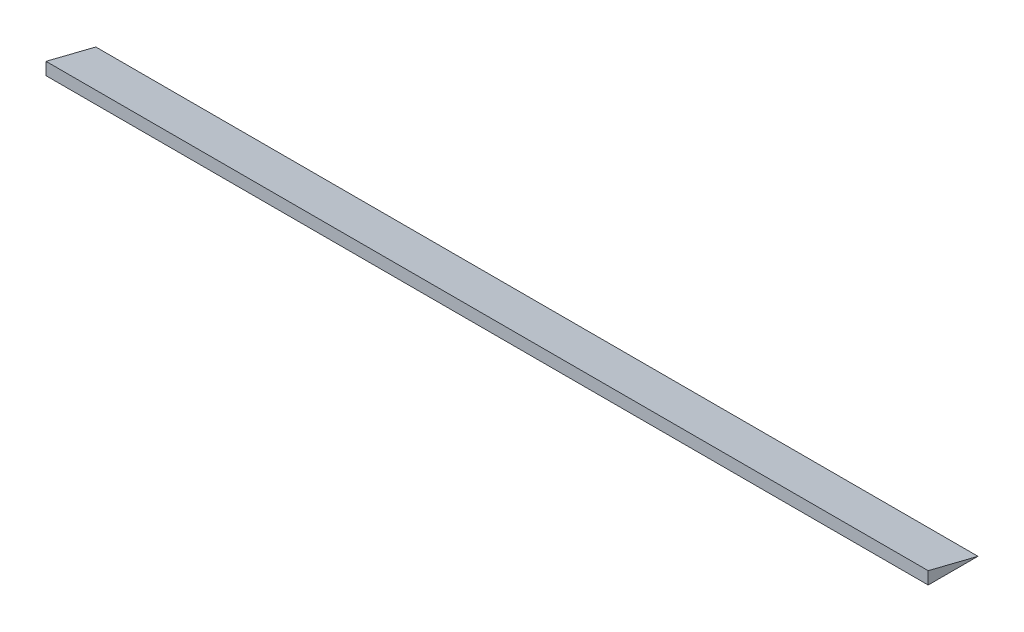
ISO-10303-21;
HEADER;
FILE_DESCRIPTION(('STEP AP214'),'2;1');
FILE_NAME('part.step','',(''),(''),'','','');
FILE_SCHEMA(('AUTOMOTIVE_DESIGN { 1 0 10303 214 1 1 1 1 }'));
ENDSEC;
DATA;
#1=APPLICATION_CONTEXT('core data for automotive mechanical design processes');
#2=APPLICATION_PROTOCOL_DEFINITION('international standard','automotive_design',2000,#1);
#3=PRODUCT_CONTEXT('',#1,'mechanical');
#4=PRODUCT('Part','Part','',(#3));
#5=PRODUCT_RELATED_PRODUCT_CATEGORY('part','',(#4));
#6=PRODUCT_DEFINITION_FORMATION('','',#4);
#7=PRODUCT_DEFINITION_CONTEXT('part definition',#1,'design');
#8=PRODUCT_DEFINITION('design','',#6,#7);
#9=PRODUCT_DEFINITION_SHAPE('','',#8);
#10=(LENGTH_UNIT() NAMED_UNIT(*) SI_UNIT(.MILLI.,.METRE.));
#11=(NAMED_UNIT(*) PLANE_ANGLE_UNIT() SI_UNIT($,.RADIAN.));
#12=(NAMED_UNIT(*) SI_UNIT($,.STERADIAN.) SOLID_ANGLE_UNIT());
#13=UNCERTAINTY_MEASURE_WITH_UNIT(LENGTH_MEASURE(1.E-05),#10,'distance_accuracy_value','');
#14=(GEOMETRIC_REPRESENTATION_CONTEXT(3) GLOBAL_UNCERTAINTY_ASSIGNED_CONTEXT((#13)) GLOBAL_UNIT_ASSIGNED_CONTEXT((#10,
#11,#12)) REPRESENTATION_CONTEXT('',''));
#15=CARTESIAN_POINT('',(0.,0.,0.));
#16=DIRECTION('',(0.,0.,1.));
#17=DIRECTION('',(1.,0.,0.));
#18=AXIS2_PLACEMENT_3D('',#15,#16,#17);
#19=CARTESIAN_POINT('',(675.,9.525,0.));
#20=DIRECTION('',(0.,0.,-1.));
#21=DIRECTION('',(0.,1.,0.));
#22=AXIS2_PLACEMENT_3D('',#19,#20,#21);
#23=PLANE('',#22);
#24=DIRECTION('',(0.,-1.,0.));
#25=VECTOR('',#24,1.);
#26=CARTESIAN_POINT('',(0.,9.525,0.));
#27=LINE('',#26,#25);
#28=CARTESIAN_POINT('',(0.,9.525,0.));
#29=VERTEX_POINT('',#28);
#30=CARTESIAN_POINT('',(0.,0.,0.));
#31=VERTEX_POINT('',#30);
#32=EDGE_CURVE('E88',#29,#31,#27,.T.);
#33=ORIENTED_EDGE('',*,*,#32,.T.);
#34=DIRECTION('',(-1.,0.,0.));
#35=VECTOR('',#34,1.);
#36=CARTESIAN_POINT('',(675.,0.,0.));
#37=LINE('',#36,#35);
#38=CARTESIAN_POINT('',(675.,0.,0.));
#39=VERTEX_POINT('',#38);
#40=EDGE_CURVE('E11',#39,#31,#37,.T.);
#41=ORIENTED_EDGE('',*,*,#40,.F.);
#42=DIRECTION('',(0.,-1.,0.));
#43=VECTOR('',#42,1.);
#44=CARTESIAN_POINT('',(675.,9.525,0.));
#45=LINE('',#44,#43);
#46=CARTESIAN_POINT('',(675.,9.525,0.));
#47=VERTEX_POINT('',#46);
#48=EDGE_CURVE('E76',#47,#39,#45,.T.);
#49=ORIENTED_EDGE('',*,*,#48,.F.);
#50=DIRECTION('',(-1.,0.,0.));
#51=VECTOR('',#50,1.);
#52=CARTESIAN_POINT('',(675.,9.525,0.));
#53=LINE('',#52,#51);
#54=EDGE_CURVE('E87',#47,#29,#53,.T.);
#55=ORIENTED_EDGE('',*,*,#54,.T.);
#56=EDGE_LOOP('',(#33,#41,#49,#55));
#57=FACE_BOUND('',#56,.T.);
#58=ADVANCED_FACE('F39',(#57),#23,.F.);
#59=CARTESIAN_POINT('',(675.,0.,0.));
#60=DIRECTION('',(0.,1.,0.));
#61=DIRECTION('',(0.,0.,1.));
#62=AXIS2_PLACEMENT_3D('',#59,#60,#61);
#63=PLANE('',#62);
#64=DIRECTION('',(0.,0.,-1.));
#65=VECTOR('',#64,1.);
#66=CARTESIAN_POINT('',(0.,0.,0.));
#67=LINE('',#66,#65);
#68=CARTESIAN_POINT('',(0.,0.,-38.1));
#69=VERTEX_POINT('',#68);
#70=EDGE_CURVE('E70',#31,#69,#67,.T.);
#71=ORIENTED_EDGE('',*,*,#70,.T.);
#72=DIRECTION('',(-1.,0.,0.));
#73=VECTOR('',#72,1.);
#74=CARTESIAN_POINT('',(675.,0.,-38.1));
#75=LINE('',#74,#73);
#76=CARTESIAN_POINT('',(675.,0.,-38.1));
#77=VERTEX_POINT('',#76);
#78=EDGE_CURVE('E50',#77,#69,#75,.T.);
#79=ORIENTED_EDGE('',*,*,#78,.F.);
#80=DIRECTION('',(0.,0.,-1.));
#81=VECTOR('',#80,1.);
#82=CARTESIAN_POINT('',(675.,0.,0.));
#83=LINE('',#82,#81);
#84=EDGE_CURVE('E73',#39,#77,#83,.T.);
#85=ORIENTED_EDGE('',*,*,#84,.F.);
#86=ORIENTED_EDGE('',*,*,#40,.T.);
#87=EDGE_LOOP('',(#71,#79,#85,#86));
#88=FACE_BOUND('',#87,.T.);
#89=ADVANCED_FACE('F77',(#88),#63,.F.);
#90=CARTESIAN_POINT('',(675.,0.,-38.1));
#91=DIRECTION('',(0.,-0.970142500145332,0.242535625036333));
#92=DIRECTION('',(0.,-0.242535625036333,-0.970142500145332));
#93=AXIS2_PLACEMENT_3D('',#90,#91,#92);
#94=PLANE('',#93);
#95=DIRECTION('',(0.,0.242535625036333,0.970142500145332));
#96=VECTOR('',#95,1.);
#97=CARTESIAN_POINT('',(0.,0.,-38.1));
#98=LINE('',#97,#96);
#99=EDGE_CURVE('E75',#69,#29,#98,.T.);
#100=ORIENTED_EDGE('',*,*,#99,.T.);
#101=ORIENTED_EDGE('',*,*,#54,.F.);
#102=DIRECTION('',(0.,0.242535625036333,0.970142500145332));
#103=VECTOR('',#102,1.);
#104=CARTESIAN_POINT('',(675.,0.,-38.1));
#105=LINE('',#104,#103);
#106=EDGE_CURVE('E54',#77,#47,#105,.T.);
#107=ORIENTED_EDGE('',*,*,#106,.F.);
#108=ORIENTED_EDGE('',*,*,#78,.T.);
#109=EDGE_LOOP('',(#100,#101,#107,#108));
#110=FACE_BOUND('',#109,.T.);
#111=ADVANCED_FACE('F94',(#110),#94,.F.);
#112=CARTESIAN_POINT('',(675.,0.,0.));
#113=DIRECTION('',(1.,0.,0.));
#114=DIRECTION('',(0.,0.,-1.));
#115=AXIS2_PLACEMENT_3D('',#112,#113,#114);
#116=PLANE('',#115);
#117=ORIENTED_EDGE('',*,*,#48,.T.);
#118=ORIENTED_EDGE('',*,*,#84,.T.);
#119=ORIENTED_EDGE('',*,*,#106,.T.);
#120=EDGE_LOOP('',(#117,#118,#119));
#121=FACE_BOUND('',#120,.T.);
#122=ADVANCED_FACE('F85',(#121),#116,.T.);
#123=CARTESIAN_POINT('',(0.,0.,0.));
#124=DIRECTION('',(1.,0.,0.));
#125=DIRECTION('',(0.,0.,-1.));
#126=AXIS2_PLACEMENT_3D('',#123,#124,#125);
#127=PLANE('',#126);
#128=ORIENTED_EDGE('',*,*,#32,.F.);
#129=ORIENTED_EDGE('',*,*,#99,.F.);
#130=ORIENTED_EDGE('',*,*,#70,.F.);
#131=EDGE_LOOP('',(#128,#129,#130));
#132=FACE_BOUND('',#131,.T.);
#133=ADVANCED_FACE('F92',(#132),#127,.F.);
#134=CLOSED_SHELL('',(#58,#89,#111,#122,#133));
#135=MANIFOLD_SOLID_BREP('B2',#134);
#136=ADVANCED_BREP_SHAPE_REPRESENTATION('',(#18,#135),#14);
#137=SHAPE_DEFINITION_REPRESENTATION(#9,#136);
ENDSEC;
END-ISO-10303-21;
